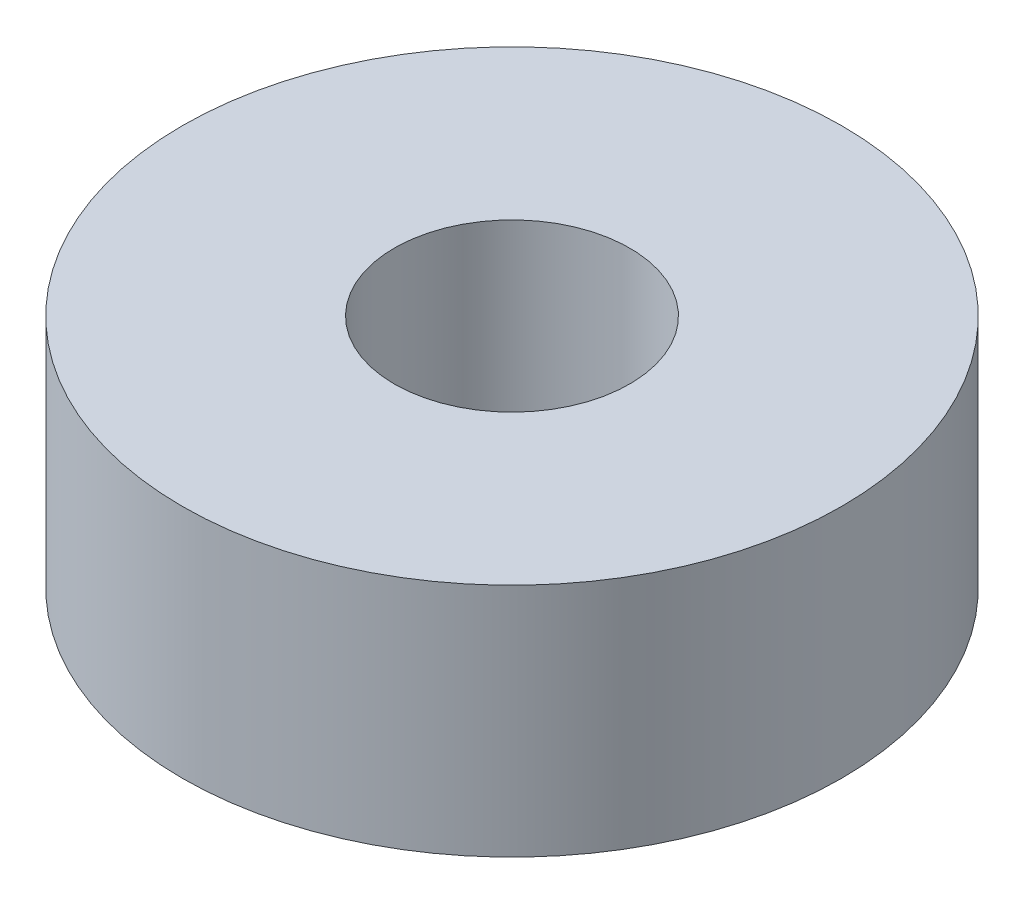
ISO-10303-21;
HEADER;
FILE_DESCRIPTION(('STEP AP214'),'2;1');
FILE_NAME('part.step','',(''),(''),'','','');
FILE_SCHEMA(('AUTOMOTIVE_DESIGN { 1 0 10303 214 1 1 1 1 }'));
ENDSEC;
DATA;
#1=APPLICATION_CONTEXT('core data for automotive mechanical design processes');
#2=APPLICATION_PROTOCOL_DEFINITION('international standard','automotive_design',2000,#1);
#3=PRODUCT_CONTEXT('',#1,'mechanical');
#4=PRODUCT('Part','Part','',(#3));
#5=PRODUCT_RELATED_PRODUCT_CATEGORY('part','',(#4));
#6=PRODUCT_DEFINITION_FORMATION('','',#4);
#7=PRODUCT_DEFINITION_CONTEXT('part definition',#1,'design');
#8=PRODUCT_DEFINITION('design','',#6,#7);
#9=PRODUCT_DEFINITION_SHAPE('','',#8);
#10=(LENGTH_UNIT() NAMED_UNIT(*) SI_UNIT(.MILLI.,.METRE.));
#11=(NAMED_UNIT(*) PLANE_ANGLE_UNIT() SI_UNIT($,.RADIAN.));
#12=(NAMED_UNIT(*) SI_UNIT($,.STERADIAN.) SOLID_ANGLE_UNIT());
#13=UNCERTAINTY_MEASURE_WITH_UNIT(LENGTH_MEASURE(1.E-05),#10,'distance_accuracy_value','');
#14=(GEOMETRIC_REPRESENTATION_CONTEXT(3) GLOBAL_UNCERTAINTY_ASSIGNED_CONTEXT((#13)) GLOBAL_UNIT_ASSIGNED_CONTEXT((#10,
#11,#12)) REPRESENTATION_CONTEXT('',''));
#15=CARTESIAN_POINT('',(0.,0.,0.));
#16=DIRECTION('',(0.,0.,1.));
#17=DIRECTION('',(1.,0.,0.));
#18=AXIS2_PLACEMENT_3D('',#15,#16,#17);
#19=CARTESIAN_POINT('',(0.,5.,0.));
#20=DIRECTION('',(0.,1.,0.));
#21=DIRECTION('',(0.,0.,1.));
#22=AXIS2_PLACEMENT_3D('',#19,#20,#21);
#23=PLANE('',#22);
#24=CARTESIAN_POINT('',(0.,5.,0.));
#25=DIRECTION('',(0.,1.,0.));
#26=DIRECTION('',(0.,0.,1.));
#27=AXIS2_PLACEMENT_3D('',#24,#25,#26);
#28=CIRCLE('',#27,7.);
#29=CARTESIAN_POINT('',(0.,5.,7.));
#30=VERTEX_POINT('',#29);
#31=EDGE_CURVE('E10',#30,#30,#28,.T.);
#32=ORIENTED_EDGE('',*,*,#31,.T.);
#33=EDGE_LOOP('',(#32));
#34=FACE_BOUND('',#33,.T.);
#35=CARTESIAN_POINT('',(0.,5.,0.));
#36=DIRECTION('',(0.,1.,0.));
#37=DIRECTION('',(0.,0.,1.));
#38=AXIS2_PLACEMENT_3D('',#35,#36,#37);
#39=CIRCLE('',#38,2.5);
#40=CARTESIAN_POINT('',(0.,5.,2.5));
#41=VERTEX_POINT('',#40);
#42=EDGE_CURVE('E45',#41,#41,#39,.T.);
#43=ORIENTED_EDGE('',*,*,#42,.F.);
#44=EDGE_LOOP('',(#43));
#45=FACE_BOUND('',#44,.T.);
#46=ADVANCED_FACE('F34',(#34,#45),#23,.T.);
#47=CARTESIAN_POINT('',(0.,0.,0.));
#48=DIRECTION('',(0.,1.,0.));
#49=DIRECTION('',(0.,0.,1.));
#50=AXIS2_PLACEMENT_3D('',#47,#48,#49);
#51=PLANE('',#50);
#52=CARTESIAN_POINT('',(0.,0.,0.));
#53=DIRECTION('',(0.,1.,0.));
#54=DIRECTION('',(0.,0.,1.));
#55=AXIS2_PLACEMENT_3D('',#52,#53,#54);
#56=CIRCLE('',#55,7.);
#57=CARTESIAN_POINT('',(0.,0.,7.));
#58=VERTEX_POINT('',#57);
#59=EDGE_CURVE('E38',#58,#58,#56,.T.);
#60=ORIENTED_EDGE('',*,*,#59,.F.);
#61=EDGE_LOOP('',(#60));
#62=FACE_BOUND('',#61,.T.);
#63=CARTESIAN_POINT('',(0.,0.,0.));
#64=DIRECTION('',(0.,1.,0.));
#65=DIRECTION('',(0.,0.,1.));
#66=AXIS2_PLACEMENT_3D('',#63,#64,#65);
#67=CIRCLE('',#66,2.5);
#68=CARTESIAN_POINT('',(0.,0.,2.5));
#69=VERTEX_POINT('',#68);
#70=EDGE_CURVE('E47',#69,#69,#67,.T.);
#71=ORIENTED_EDGE('',*,*,#70,.T.);
#72=EDGE_LOOP('',(#71));
#73=FACE_BOUND('',#72,.T.);
#74=ADVANCED_FACE('F57',(#62,#73),#51,.F.);
#75=CARTESIAN_POINT('',(0.,5.,0.));
#76=DIRECTION('',(0.,-1.,0.));
#77=DIRECTION('',(0.,0.,-1.));
#78=AXIS2_PLACEMENT_3D('',#75,#76,#77);
#79=CYLINDRICAL_SURFACE('',#78,7.);
#80=ORIENTED_EDGE('',*,*,#31,.F.);
#81=EDGE_LOOP('',(#80));
#82=FACE_BOUND('',#81,.T.);
#83=ORIENTED_EDGE('',*,*,#59,.T.);
#84=EDGE_LOOP('',(#83));
#85=FACE_BOUND('',#84,.T.);
#86=ADVANCED_FACE('F36',(#82,#85),#79,.T.);
#87=CARTESIAN_POINT('',(0.,5.,0.));
#88=DIRECTION('',(0.,-1.,0.));
#89=DIRECTION('',(0.,0.,-1.));
#90=AXIS2_PLACEMENT_3D('',#87,#88,#89);
#91=CYLINDRICAL_SURFACE('',#90,2.5);
#92=ORIENTED_EDGE('',*,*,#42,.T.);
#93=EDGE_LOOP('',(#92));
#94=FACE_BOUND('',#93,.T.);
#95=ORIENTED_EDGE('',*,*,#70,.F.);
#96=EDGE_LOOP('',(#95));
#97=FACE_BOUND('',#96,.T.);
#98=ADVANCED_FACE('F53',(#94,#97),#91,.F.);
#99=CLOSED_SHELL('',(#46,#74,#86,#98));
#100=MANIFOLD_SOLID_BREP('B2',#99);
#101=ADVANCED_BREP_SHAPE_REPRESENTATION('',(#18,#100),#14);
#102=SHAPE_DEFINITION_REPRESENTATION(#9,#101);
ENDSEC;
END-ISO-10303-21;
